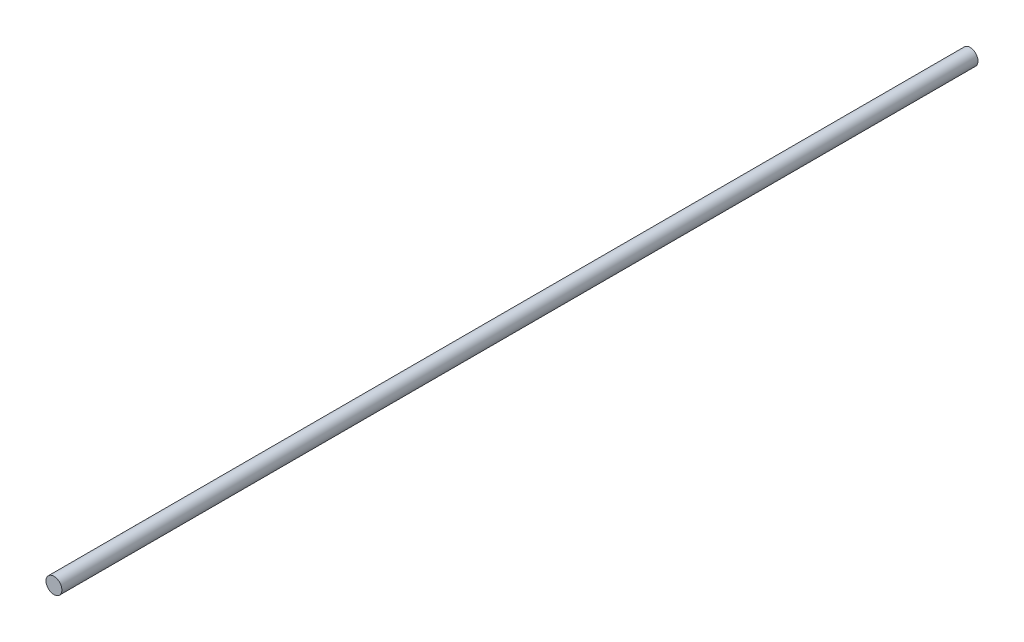
ISO-10303-21;
HEADER;
FILE_DESCRIPTION(('STEP AP214'),'2;1');
FILE_NAME('part.step','',(''),(''),'','','');
FILE_SCHEMA(('AUTOMOTIVE_DESIGN { 1 0 10303 214 1 1 1 1 }'));
ENDSEC;
DATA;
#1=APPLICATION_CONTEXT('core data for automotive mechanical design processes');
#2=APPLICATION_PROTOCOL_DEFINITION('international standard','automotive_design',2000,#1);
#3=PRODUCT_CONTEXT('',#1,'mechanical');
#4=PRODUCT('Part','Part','',(#3));
#5=PRODUCT_RELATED_PRODUCT_CATEGORY('part','',(#4));
#6=PRODUCT_DEFINITION_FORMATION('','',#4);
#7=PRODUCT_DEFINITION_CONTEXT('part definition',#1,'design');
#8=PRODUCT_DEFINITION('design','',#6,#7);
#9=PRODUCT_DEFINITION_SHAPE('','',#8);
#10=(LENGTH_UNIT() NAMED_UNIT(*) SI_UNIT(.MILLI.,.METRE.));
#11=(NAMED_UNIT(*) PLANE_ANGLE_UNIT() SI_UNIT($,.RADIAN.));
#12=(NAMED_UNIT(*) SI_UNIT($,.STERADIAN.) SOLID_ANGLE_UNIT());
#13=UNCERTAINTY_MEASURE_WITH_UNIT(LENGTH_MEASURE(1.E-05),#10,'distance_accuracy_value','');
#14=(GEOMETRIC_REPRESENTATION_CONTEXT(3) GLOBAL_UNCERTAINTY_ASSIGNED_CONTEXT((#13)) GLOBAL_UNIT_ASSIGNED_CONTEXT((#10,
#11,#12)) REPRESENTATION_CONTEXT('',''));
#15=CARTESIAN_POINT('',(0.,0.,0.));
#16=DIRECTION('',(0.,0.,1.));
#17=DIRECTION('',(1.,0.,0.));
#18=AXIS2_PLACEMENT_3D('',#15,#16,#17);
#19=CARTESIAN_POINT('',(0.,0.,576.6));
#20=DIRECTION('',(0.,0.,-1.));
#21=DIRECTION('',(-1.,0.,0.));
#22=AXIS2_PLACEMENT_3D('',#19,#20,#21);
#23=CYLINDRICAL_SURFACE('',#22,5.);
#24=CARTESIAN_POINT('',(0.,0.,576.6));
#25=DIRECTION('',(0.,0.,1.));
#26=DIRECTION('',(1.,0.,0.));
#27=AXIS2_PLACEMENT_3D('',#24,#25,#26);
#28=CIRCLE('',#27,5.);
#29=CARTESIAN_POINT('',(5.,0.,576.6));
#30=VERTEX_POINT('',#29);
#31=EDGE_CURVE('E10',#30,#30,#28,.T.);
#32=ORIENTED_EDGE('',*,*,#31,.F.);
#33=EDGE_LOOP('',(#32));
#34=FACE_BOUND('',#33,.T.);
#35=CARTESIAN_POINT('',(0.,0.,0.));
#36=DIRECTION('',(0.,0.,1.));
#37=DIRECTION('',(1.,0.,0.));
#38=AXIS2_PLACEMENT_3D('',#35,#36,#37);
#39=CIRCLE('',#38,5.);
#40=CARTESIAN_POINT('',(5.,0.,0.));
#41=VERTEX_POINT('',#40);
#42=EDGE_CURVE('E36',#41,#41,#39,.T.);
#43=ORIENTED_EDGE('',*,*,#42,.T.);
#44=EDGE_LOOP('',(#43));
#45=FACE_BOUND('',#44,.T.);
#46=ADVANCED_FACE('F33',(#34,#45),#23,.T.);
#47=CARTESIAN_POINT('',(0.,0.,576.6));
#48=DIRECTION('',(0.,0.,1.));
#49=DIRECTION('',(1.,0.,0.));
#50=AXIS2_PLACEMENT_3D('',#47,#48,#49);
#51=PLANE('',#50);
#52=ORIENTED_EDGE('',*,*,#31,.T.);
#53=EDGE_LOOP('',(#52));
#54=FACE_BOUND('',#53,.T.);
#55=ADVANCED_FACE('F48',(#54),#51,.T.);
#56=CARTESIAN_POINT('',(0.,0.,0.));
#57=DIRECTION('',(0.,0.,1.));
#58=DIRECTION('',(1.,0.,0.));
#59=AXIS2_PLACEMENT_3D('',#56,#57,#58);
#60=PLANE('',#59);
#61=ORIENTED_EDGE('',*,*,#42,.F.);
#62=EDGE_LOOP('',(#61));
#63=FACE_BOUND('',#62,.T.);
#64=ADVANCED_FACE('F46',(#63),#60,.F.);
#65=CLOSED_SHELL('',(#46,#55,#64));
#66=MANIFOLD_SOLID_BREP('B2',#65);
#67=ADVANCED_BREP_SHAPE_REPRESENTATION('',(#18,#66),#14);
#68=SHAPE_DEFINITION_REPRESENTATION(#9,#67);
ENDSEC;
END-ISO-10303-21;
